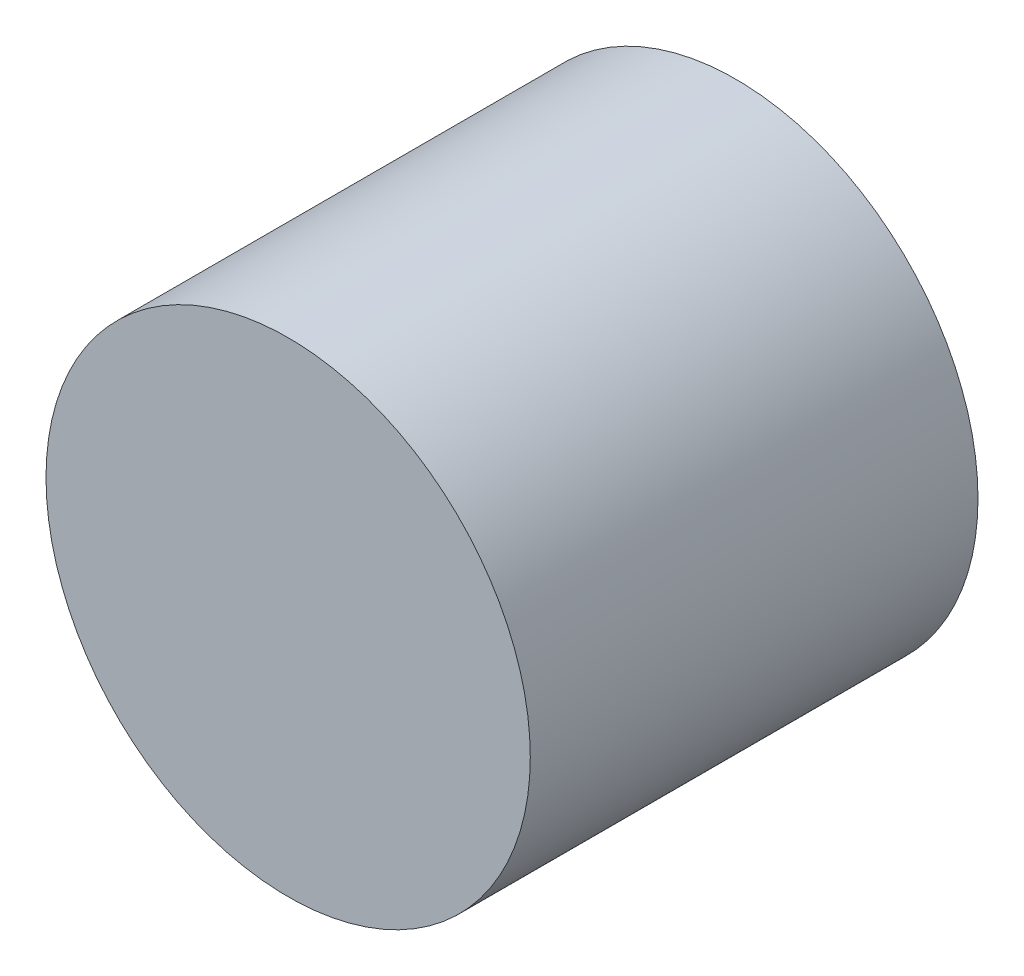
ISO-10303-21;
HEADER;
FILE_DESCRIPTION(('STEP AP214'),'2;1');
FILE_NAME('part.step','',(''),(''),'','','');
FILE_SCHEMA(('AUTOMOTIVE_DESIGN { 1 0 10303 214 1 1 1 1 }'));
ENDSEC;
DATA;
#1=APPLICATION_CONTEXT('core data for automotive mechanical design processes');
#2=APPLICATION_PROTOCOL_DEFINITION('international standard','automotive_design',2000,#1);
#3=PRODUCT_CONTEXT('',#1,'mechanical');
#4=PRODUCT('Part','Part','',(#3));
#5=PRODUCT_RELATED_PRODUCT_CATEGORY('part','',(#4));
#6=PRODUCT_DEFINITION_FORMATION('','',#4);
#7=PRODUCT_DEFINITION_CONTEXT('part definition',#1,'design');
#8=PRODUCT_DEFINITION('design','',#6,#7);
#9=PRODUCT_DEFINITION_SHAPE('','',#8);
#10=(LENGTH_UNIT() NAMED_UNIT(*) SI_UNIT(.MILLI.,.METRE.));
#11=(NAMED_UNIT(*) PLANE_ANGLE_UNIT() SI_UNIT($,.RADIAN.));
#12=(NAMED_UNIT(*) SI_UNIT($,.STERADIAN.) SOLID_ANGLE_UNIT());
#13=UNCERTAINTY_MEASURE_WITH_UNIT(LENGTH_MEASURE(1.E-05),#10,'distance_accuracy_value','');
#14=(GEOMETRIC_REPRESENTATION_CONTEXT(3) GLOBAL_UNCERTAINTY_ASSIGNED_CONTEXT((#13)) GLOBAL_UNIT_ASSIGNED_CONTEXT((#10,
#11,#12)) REPRESENTATION_CONTEXT('',''));
#15=CARTESIAN_POINT('',(0.,0.,0.));
#16=DIRECTION('',(0.,0.,1.));
#17=DIRECTION('',(1.,0.,0.));
#18=AXIS2_PLACEMENT_3D('',#15,#16,#17);
#19=CARTESIAN_POINT('',(0.,0.,0.));
#20=DIRECTION('',(0.,0.,-1.));
#21=DIRECTION('',(-1.,0.,0.));
#22=AXIS2_PLACEMENT_3D('',#19,#20,#21);
#23=PLANE('',#22);
#24=CARTESIAN_POINT('',(0.,0.,0.));
#25=DIRECTION('',(0.,0.,-1.));
#26=DIRECTION('',(-1.,0.,0.));
#27=AXIS2_PLACEMENT_3D('',#24,#25,#26);
#28=CIRCLE('',#27,20.8531021515592);
#29=CARTESIAN_POINT('',(-20.8531021515592,0.,0.));
#30=VERTEX_POINT('',#29);
#31=EDGE_CURVE('E34',#30,#30,#28,.T.);
#32=ORIENTED_EDGE('',*,*,#31,.T.);
#33=EDGE_LOOP('',(#32));
#34=FACE_BOUND('',#33,.T.);
#35=CARTESIAN_POINT('',(0.,0.,0.));
#36=DIRECTION('',(0.,0.,1.));
#37=DIRECTION('',(1.,0.,0.));
#38=AXIS2_PLACEMENT_3D('',#35,#36,#37);
#39=CIRCLE('',#38,45.1496688722317);
#40=CARTESIAN_POINT('',(45.1496688722317,0.,0.));
#41=VERTEX_POINT('',#40);
#42=EDGE_CURVE('E10',#41,#41,#39,.T.);
#43=ORIENTED_EDGE('',*,*,#42,.T.);
#44=EDGE_LOOP('',(#43));
#45=FACE_BOUND('',#44,.T.);
#46=ADVANCED_FACE('F30',(#34,#45),#23,.F.);
#47=CARTESIAN_POINT('',(0.,0.,83.));
#48=DIRECTION('',(0.,0.,1.));
#49=DIRECTION('',(1.,0.,0.));
#50=AXIS2_PLACEMENT_3D('',#47,#48,#49);
#51=PLANE('',#50);
#52=CARTESIAN_POINT('',(0.,0.,83.));
#53=DIRECTION('',(0.,0.,1.));
#54=DIRECTION('',(1.,0.,0.));
#55=AXIS2_PLACEMENT_3D('',#52,#53,#54);
#56=CIRCLE('',#55,45.1496688722317);
#57=CARTESIAN_POINT('',(45.1496688722317,0.,83.));
#58=VERTEX_POINT('',#57);
#59=EDGE_CURVE('E38',#58,#58,#56,.T.);
#60=ORIENTED_EDGE('',*,*,#59,.F.);
#61=EDGE_LOOP('',(#60));
#62=FACE_BOUND('',#61,.T.);
#63=ADVANCED_FACE('F68',(#62),#51,.F.);
#64=CARTESIAN_POINT('',(0.,0.,83.));
#65=DIRECTION('',(0.,0.,-1.));
#66=DIRECTION('',(-1.,0.,0.));
#67=AXIS2_PLACEMENT_3D('',#64,#65,#66);
#68=CYLINDRICAL_SURFACE('',#67,45.1496688722317);
#69=ORIENTED_EDGE('',*,*,#59,.T.);
#70=EDGE_LOOP('',(#69));
#71=FACE_BOUND('',#70,.T.);
#72=ORIENTED_EDGE('',*,*,#42,.F.);
#73=EDGE_LOOP('',(#72));
#74=FACE_BOUND('',#73,.T.);
#75=ADVANCED_FACE('F60',(#71,#74),#68,.F.);
#76=CARTESIAN_POINT('',(0.,0.,14.));
#77=DIRECTION('',(0.,0.,-1.));
#78=DIRECTION('',(-1.,0.,0.));
#79=AXIS2_PLACEMENT_3D('',#76,#77,#78);
#80=CYLINDRICAL_SURFACE('',#79,20.8531021515592);
#81=CARTESIAN_POINT('',(0.,0.,-3.));
#82=DIRECTION('',(0.,0.,-1.));
#83=DIRECTION('',(-1.,0.,0.));
#84=AXIS2_PLACEMENT_3D('',#81,#82,#83);
#85=CIRCLE('',#84,20.8531021515592);
#86=CARTESIAN_POINT('',(-20.8531021515592,0.,-3.));
#87=VERTEX_POINT('',#86);
#88=EDGE_CURVE('E50',#87,#87,#85,.T.);
#89=ORIENTED_EDGE('',*,*,#88,.T.);
#90=EDGE_LOOP('',(#89));
#91=FACE_BOUND('',#90,.T.);
#92=ORIENTED_EDGE('',*,*,#31,.F.);
#93=EDGE_LOOP('',(#92));
#94=FACE_BOUND('',#93,.T.);
#95=ADVANCED_FACE('F58',(#91,#94),#80,.F.);
#96=CARTESIAN_POINT('',(0.,0.,83.));
#97=DIRECTION('',(0.,0.,-1.));
#98=DIRECTION('',(-1.,0.,0.));
#99=AXIS2_PLACEMENT_3D('',#96,#97,#98);
#100=CYLINDRICAL_SURFACE('',#99,48.1376920385879);
#101=CARTESIAN_POINT('',(0.,0.,86.));
#102=DIRECTION('',(0.,0.,1.));
#103=DIRECTION('',(1.,0.,0.));
#104=AXIS2_PLACEMENT_3D('',#101,#102,#103);
#105=CIRCLE('',#104,48.1376920385879);
#106=CARTESIAN_POINT('',(48.1376920385879,0.,86.));
#107=VERTEX_POINT('',#106);
#108=EDGE_CURVE('E42',#107,#107,#105,.T.);
#109=ORIENTED_EDGE('',*,*,#108,.F.);
#110=EDGE_LOOP('',(#109));
#111=FACE_BOUND('',#110,.T.);
#112=CARTESIAN_POINT('',(0.,0.,-3.));
#113=DIRECTION('',(0.,0.,-1.));
#114=DIRECTION('',(-1.,0.,0.));
#115=AXIS2_PLACEMENT_3D('',#112,#113,#114);
#116=CIRCLE('',#115,48.1376920385879);
#117=CARTESIAN_POINT('',(-48.1376920385879,0.,-3.));
#118=VERTEX_POINT('',#117);
#119=EDGE_CURVE('E47',#118,#118,#116,.T.);
#120=ORIENTED_EDGE('',*,*,#119,.F.);
#121=EDGE_LOOP('',(#120));
#122=FACE_BOUND('',#121,.T.);
#123=ADVANCED_FACE('F32',(#111,#122),#100,.T.);
#124=CARTESIAN_POINT('',(0.,0.,86.));
#125=DIRECTION('',(0.,0.,1.));
#126=DIRECTION('',(1.,0.,0.));
#127=AXIS2_PLACEMENT_3D('',#124,#125,#126);
#128=PLANE('',#127);
#129=ORIENTED_EDGE('',*,*,#108,.T.);
#130=EDGE_LOOP('',(#129));
#131=FACE_BOUND('',#130,.T.);
#132=ADVANCED_FACE('F66',(#131),#128,.T.);
#133=CARTESIAN_POINT('',(0.,0.,-3.));
#134=DIRECTION('',(0.,0.,-1.));
#135=DIRECTION('',(-1.,0.,0.));
#136=AXIS2_PLACEMENT_3D('',#133,#134,#135);
#137=PLANE('',#136);
#138=ORIENTED_EDGE('',*,*,#88,.F.);
#139=EDGE_LOOP('',(#138));
#140=FACE_BOUND('',#139,.T.);
#141=ORIENTED_EDGE('',*,*,#119,.T.);
#142=EDGE_LOOP('',(#141));
#143=FACE_BOUND('',#142,.T.);
#144=ADVANCED_FACE('F79',(#140,#143),#137,.T.);
#145=CLOSED_SHELL('',(#46,#63,#75,#95,#123,#132,#144));
#146=MANIFOLD_SOLID_BREP('B2',#145);
#147=ADVANCED_BREP_SHAPE_REPRESENTATION('',(#18,#146),#14);
#148=SHAPE_DEFINITION_REPRESENTATION(#9,#147);
ENDSEC;
END-ISO-10303-21;
